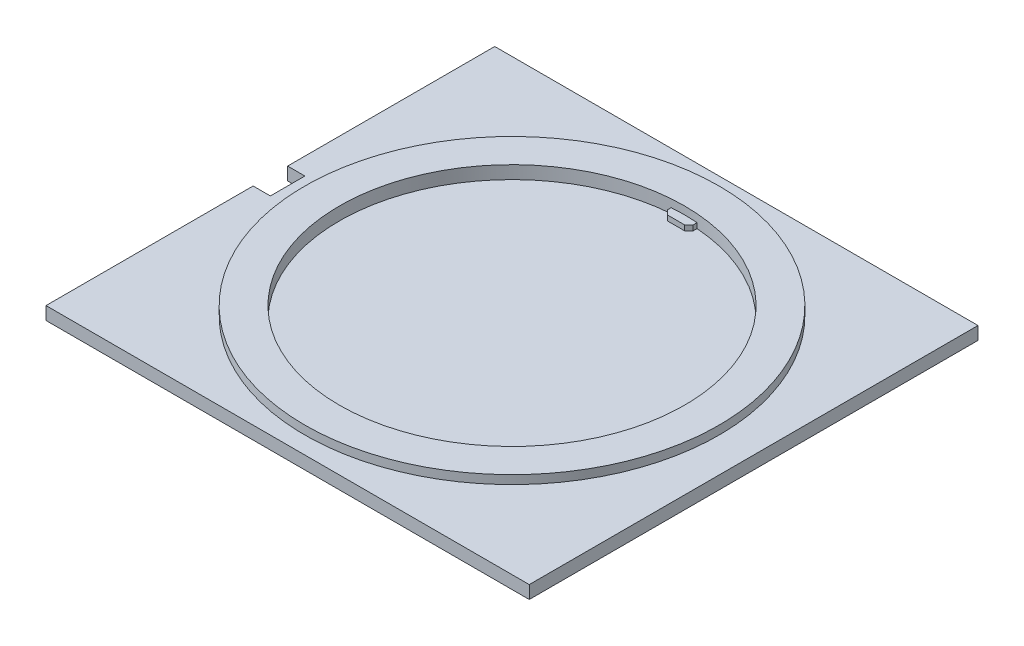
ISO-10303-21;
HEADER;
FILE_DESCRIPTION(('STEP AP214'),'2;1');
FILE_NAME('part.step','',(''),(''),'','','');
FILE_SCHEMA(('AUTOMOTIVE_DESIGN { 1 0 10303 214 1 1 1 1 }'));
ENDSEC;
DATA;
#1=APPLICATION_CONTEXT('core data for automotive mechanical design processes');
#2=APPLICATION_PROTOCOL_DEFINITION('international standard','automotive_design',2000,#1);
#3=PRODUCT_CONTEXT('',#1,'mechanical');
#4=PRODUCT('Part','Part','',(#3));
#5=PRODUCT_RELATED_PRODUCT_CATEGORY('part','',(#4));
#6=PRODUCT_DEFINITION_FORMATION('','',#4);
#7=PRODUCT_DEFINITION_CONTEXT('part definition',#1,'design');
#8=PRODUCT_DEFINITION('design','',#6,#7);
#9=PRODUCT_DEFINITION_SHAPE('','',#8);
#10=(LENGTH_UNIT() NAMED_UNIT(*) SI_UNIT(.MILLI.,.METRE.));
#11=(NAMED_UNIT(*) PLANE_ANGLE_UNIT() SI_UNIT($,.RADIAN.));
#12=(NAMED_UNIT(*) SI_UNIT($,.STERADIAN.) SOLID_ANGLE_UNIT());
#13=UNCERTAINTY_MEASURE_WITH_UNIT(LENGTH_MEASURE(1.E-05),#10,'distance_accuracy_value','');
#14=(GEOMETRIC_REPRESENTATION_CONTEXT(3) GLOBAL_UNCERTAINTY_ASSIGNED_CONTEXT((#13)) GLOBAL_UNIT_ASSIGNED_CONTEXT((#10,
#11,#12)) REPRESENTATION_CONTEXT('',''));
#15=CARTESIAN_POINT('',(0.,0.,0.));
#16=DIRECTION('',(0.,0.,1.));
#17=DIRECTION('',(1.,0.,0.));
#18=AXIS2_PLACEMENT_3D('',#15,#16,#17);
#19=CARTESIAN_POINT('',(-28.,77.9198926981712,-26.));
#20=DIRECTION('',(-1.,0.,0.));
#21=DIRECTION('',(0.,0.,1.));
#22=AXIS2_PLACEMENT_3D('',#19,#20,#21);
#23=PLANE('',#22);
#24=DIRECTION('',(0.,-1.,0.));
#25=VECTOR('',#24,1.);
#26=CARTESIAN_POINT('',(-28.,77.9198926981712,-2.00000000000001));
#27=LINE('',#26,#25);
#28=CARTESIAN_POINT('',(-28.,1.5,-2.00000000000001));
#29=VERTEX_POINT('',#28);
#30=CARTESIAN_POINT('',(-28.,0.,-2.00000000000001));
#31=VERTEX_POINT('',#30);
#32=EDGE_CURVE('E147',#29,#31,#27,.T.);
#33=ORIENTED_EDGE('',*,*,#32,.F.);
#34=DIRECTION('',(0.,0.,1.));
#35=VECTOR('',#34,1.);
#36=CARTESIAN_POINT('',(-28.,1.5,-26.));
#37=LINE('',#36,#35);
#38=CARTESIAN_POINT('',(-28.,1.5,-26.));
#39=VERTEX_POINT('',#38);
#40=EDGE_CURVE('E195',#39,#29,#37,.T.);
#41=ORIENTED_EDGE('',*,*,#40,.F.);
#42=DIRECTION('',(0.,-1.,0.));
#43=VECTOR('',#42,1.);
#44=CARTESIAN_POINT('',(-28.,77.9198926981712,-26.));
#45=LINE('',#44,#43);
#46=CARTESIAN_POINT('',(-28.,0.,-26.));
#47=VERTEX_POINT('',#46);
#48=EDGE_CURVE('E216',#39,#47,#45,.T.);
#49=ORIENTED_EDGE('',*,*,#48,.T.);
#50=DIRECTION('',(0.,0.,-1.));
#51=VECTOR('',#50,1.);
#52=CARTESIAN_POINT('',(-28.,0.,-26.));
#53=LINE('',#52,#51);
#54=EDGE_CURVE('E207',#31,#47,#53,.T.);
#55=ORIENTED_EDGE('',*,*,#54,.F.);
#56=EDGE_LOOP('',(#33,#41,#49,#55));
#57=FACE_BOUND('',#56,.T.);
#58=ADVANCED_FACE('F35',(#57),#23,.T.);
#59=CARTESIAN_POINT('',(0.,2.5,0.));
#60=DIRECTION('',(0.,-1.,0.));
#61=DIRECTION('',(0.,0.,-1.));
#62=AXIS2_PLACEMENT_3D('',#59,#60,#61);
#63=CYLINDRICAL_SURFACE('',#62,20.);
#64=CARTESIAN_POINT('',(0.,2.5,0.));
#65=DIRECTION('',(0.,1.,0.));
#66=DIRECTION('',(0.,0.,1.));
#67=AXIS2_PLACEMENT_3D('',#64,#65,#66);
#68=CIRCLE('',#67,20.);
#69=CARTESIAN_POINT('',(0.,2.5,20.));
#70=VERTEX_POINT('',#69);
#71=EDGE_CURVE('E222',#70,#70,#68,.T.);
#72=ORIENTED_EDGE('',*,*,#71,.T.);
#73=EDGE_LOOP('',(#72));
#74=FACE_BOUND('',#73,.T.);
#75=CARTESIAN_POINT('',(0.,1.,0.));
#76=DIRECTION('',(0.,-1.,0.));
#77=DIRECTION('',(0.,0.,-1.));
#78=AXIS2_PLACEMENT_3D('',#75,#76,#77);
#79=CIRCLE('',#78,20.);
#80=CARTESIAN_POINT('',(1.49999999999997,1.,-19.9436706751791));
#81=VERTEX_POINT('',#80);
#82=CARTESIAN_POINT('',(-1.50000000000003,1.,-19.9436706751791));
#83=VERTEX_POINT('',#82);
#84=EDGE_CURVE('E193',#81,#83,#79,.T.);
#85=ORIENTED_EDGE('',*,*,#84,.T.);
#86=DIRECTION('',(0.,-1.,0.));
#87=VECTOR('',#86,1.);
#88=CARTESIAN_POINT('',(-1.50000000000003,1.6,-19.9436706751791));
#89=LINE('',#88,#87);
#90=CARTESIAN_POINT('',(-1.50000000000003,1.6,-19.9436706751791));
#91=VERTEX_POINT('',#90);
#92=EDGE_CURVE('E188',#91,#83,#89,.T.);
#93=ORIENTED_EDGE('',*,*,#92,.F.);
#94=CARTESIAN_POINT('',(0.,1.6,0.));
#95=DIRECTION('',(0.,1.,0.));
#96=DIRECTION('',(0.,0.,1.));
#97=AXIS2_PLACEMENT_3D('',#94,#95,#96);
#98=CIRCLE('',#97,20.);
#99=CARTESIAN_POINT('',(1.49999999999997,1.6,-19.9436706751791));
#100=VERTEX_POINT('',#99);
#101=EDGE_CURVE('E167',#100,#91,#98,.T.);
#102=ORIENTED_EDGE('',*,*,#101,.F.);
#103=DIRECTION('',(0.,-1.,0.));
#104=VECTOR('',#103,1.);
#105=CARTESIAN_POINT('',(1.49999999999997,1.6,-19.9436706751791));
#106=LINE('',#105,#104);
#107=EDGE_CURVE('E180',#100,#81,#106,.T.);
#108=ORIENTED_EDGE('',*,*,#107,.T.);
#109=EDGE_LOOP('',(#85,#93,#102,#108));
#110=FACE_BOUND('',#109,.T.);
#111=ADVANCED_FACE('F267',(#74,#110),#63,.F.);
#112=CARTESIAN_POINT('',(0.,1.,0.));
#113=DIRECTION('',(0.,-1.,0.));
#114=DIRECTION('',(0.,0.,-1.));
#115=AXIS2_PLACEMENT_3D('',#112,#113,#114);
#116=PLANE('',#115);
#117=DIRECTION('',(0.,0.,1.));
#118=VECTOR('',#117,1.);
#119=CARTESIAN_POINT('',(-1.50000000000003,1.,0.));
#120=LINE('',#119,#118);
#121=CARTESIAN_POINT('',(-1.50000000000003,1.,-19.5));
#122=VERTEX_POINT('',#121);
#123=EDGE_CURVE('E166',#83,#122,#120,.T.);
#124=ORIENTED_EDGE('',*,*,#123,.F.);
#125=ORIENTED_EDGE('',*,*,#84,.F.);
#126=DIRECTION('',(0.,0.,1.));
#127=VECTOR('',#126,1.);
#128=CARTESIAN_POINT('',(1.49999999999997,1.,0.));
#129=LINE('',#128,#127);
#130=CARTESIAN_POINT('',(1.49999999999997,1.,-19.5));
#131=VERTEX_POINT('',#130);
#132=EDGE_CURVE('E171',#81,#131,#129,.T.);
#133=ORIENTED_EDGE('',*,*,#132,.T.);
#134=DIRECTION('',(0.70710678118655,0.,-0.707106781186545));
#135=VECTOR('',#134,1.);
#136=CARTESIAN_POINT('',(-9.00000000000002,1.,-9.00000000000008));
#137=LINE('',#136,#135);
#138=CARTESIAN_POINT('',(0.999999999999972,1.,-19.));
#139=VERTEX_POINT('',#138);
#140=EDGE_CURVE('E247',#131,#139,#137,.F.);
#141=ORIENTED_EDGE('',*,*,#140,.T.);
#142=DIRECTION('',(-1.,0.,0.));
#143=VECTOR('',#142,1.);
#144=CARTESIAN_POINT('',(0.,1.,-19.));
#145=LINE('',#144,#143);
#146=CARTESIAN_POINT('',(-1.00000000000003,1.,-19.));
#147=VERTEX_POINT('',#146);
#148=EDGE_CURVE('E182',#139,#147,#145,.T.);
#149=ORIENTED_EDGE('',*,*,#148,.T.);
#150=DIRECTION('',(-0.707106781186548,0.,-0.707106781186547));
#151=VECTOR('',#150,1.);
#152=CARTESIAN_POINT('',(8.99999999999999,1.,-8.99999999999999));
#153=LINE('',#152,#151);
#154=EDGE_CURVE('E43',#147,#122,#153,.T.);
#155=ORIENTED_EDGE('',*,*,#154,.T.);
#156=EDGE_LOOP('',(#124,#125,#133,#141,#149,#155));
#157=FACE_BOUND('',#156,.T.);
#158=ADVANCED_FACE('F249',(#157),#116,.F.);
#159=CARTESIAN_POINT('',(0.,2.5,0.));
#160=DIRECTION('',(0.,-1.,0.));
#161=DIRECTION('',(0.,0.,-1.));
#162=AXIS2_PLACEMENT_3D('',#159,#160,#161);
#163=CYLINDRICAL_SURFACE('',#162,24.);
#164=CARTESIAN_POINT('',(0.,2.5,0.));
#165=DIRECTION('',(0.,1.,0.));
#166=DIRECTION('',(0.,0.,1.));
#167=AXIS2_PLACEMENT_3D('',#164,#165,#166);
#168=CIRCLE('',#167,24.);
#169=CARTESIAN_POINT('',(0.,2.5,24.));
#170=VERTEX_POINT('',#169);
#171=EDGE_CURVE('E225',#170,#170,#168,.T.);
#172=ORIENTED_EDGE('',*,*,#171,.F.);
#173=EDGE_LOOP('',(#172));
#174=FACE_BOUND('',#173,.T.);
#175=CARTESIAN_POINT('',(0.,1.5,0.));
#176=DIRECTION('',(0.,-1.,0.));
#177=DIRECTION('',(0.,0.,-1.));
#178=AXIS2_PLACEMENT_3D('',#175,#176,#177);
#179=CIRCLE('',#178,24.);
#180=CARTESIAN_POINT('',(0.,1.5,-24.));
#181=VERTEX_POINT('',#180);
#182=EDGE_CURVE('E228',#181,#181,#179,.T.);
#183=ORIENTED_EDGE('',*,*,#182,.F.);
#184=EDGE_LOOP('',(#183));
#185=FACE_BOUND('',#184,.T.);
#186=ADVANCED_FACE('F350',(#174,#185),#163,.T.);
#187=CARTESIAN_POINT('',(0.,2.5,0.));
#188=DIRECTION('',(0.,1.,0.));
#189=DIRECTION('',(0.,0.,1.));
#190=AXIS2_PLACEMENT_3D('',#187,#188,#189);
#191=PLANE('',#190);
#192=ORIENTED_EDGE('',*,*,#171,.T.);
#193=EDGE_LOOP('',(#192));
#194=FACE_BOUND('',#193,.T.);
#195=ORIENTED_EDGE('',*,*,#71,.F.);
#196=EDGE_LOOP('',(#195));
#197=FACE_BOUND('',#196,.T.);
#198=ADVANCED_FACE('F303',(#194,#197),#191,.T.);
#199=CARTESIAN_POINT('',(-28.,77.9198926981712,26.));
#200=DIRECTION('',(0.,0.,1.));
#201=DIRECTION('',(1.,0.,0.));
#202=AXIS2_PLACEMENT_3D('',#199,#200,#201);
#203=PLANE('',#202);
#204=DIRECTION('',(1.,0.,0.));
#205=VECTOR('',#204,1.);
#206=CARTESIAN_POINT('',(-28.,1.5,26.));
#207=LINE('',#206,#205);
#208=CARTESIAN_POINT('',(-28.,1.5,26.));
#209=VERTEX_POINT('',#208);
#210=CARTESIAN_POINT('',(28.,1.5,26.));
#211=VERTEX_POINT('',#210);
#212=EDGE_CURVE('E191',#209,#211,#207,.T.);
#213=ORIENTED_EDGE('',*,*,#212,.F.);
#214=DIRECTION('',(0.,-1.,0.));
#215=VECTOR('',#214,1.);
#216=CARTESIAN_POINT('',(-28.,77.9198926981712,26.));
#217=LINE('',#216,#215);
#218=CARTESIAN_POINT('',(-28.,0.,26.));
#219=VERTEX_POINT('',#218);
#220=EDGE_CURVE('E219',#209,#219,#217,.T.);
#221=ORIENTED_EDGE('',*,*,#220,.T.);
#222=DIRECTION('',(-1.,0.,0.));
#223=VECTOR('',#222,1.);
#224=CARTESIAN_POINT('',(-28.,0.,26.));
#225=LINE('',#224,#223);
#226=CARTESIAN_POINT('',(28.,0.,26.));
#227=VERTEX_POINT('',#226);
#228=EDGE_CURVE('E204',#227,#219,#225,.T.);
#229=ORIENTED_EDGE('',*,*,#228,.F.);
#230=DIRECTION('',(0.,-1.,0.));
#231=VECTOR('',#230,1.);
#232=CARTESIAN_POINT('',(28.,77.9198926981712,26.));
#233=LINE('',#232,#231);
#234=EDGE_CURVE('E213',#211,#227,#233,.T.);
#235=ORIENTED_EDGE('',*,*,#234,.F.);
#236=EDGE_LOOP('',(#213,#221,#229,#235));
#237=FACE_BOUND('',#236,.T.);
#238=ADVANCED_FACE('F295',(#237),#203,.T.);
#239=DIRECTION('',(0.,1.,0.));
#240=VECTOR('',#239,1.);
#241=CARTESIAN_POINT('',(-28.,77.9198926981712,1.99999999999999));
#242=LINE('',#241,#240);
#243=CARTESIAN_POINT('',(-28.,0.,1.99999999999999));
#244=VERTEX_POINT('',#243);
#245=CARTESIAN_POINT('',(-28.,1.5,1.99999999999999));
#246=VERTEX_POINT('',#245);
#247=EDGE_CURVE('E160',#244,#246,#242,.T.);
#248=ORIENTED_EDGE('',*,*,#247,.F.);
#249=EDGE_CURVE('E208',#219,#244,#53,.T.);
#250=ORIENTED_EDGE('',*,*,#249,.F.);
#251=ORIENTED_EDGE('',*,*,#220,.F.);
#252=EDGE_CURVE('E199',#246,#209,#37,.T.);
#253=ORIENTED_EDGE('',*,*,#252,.F.);
#254=EDGE_LOOP('',(#248,#250,#251,#253));
#255=FACE_BOUND('',#254,.T.);
#256=ADVANCED_FACE('F283',(#255),#23,.T.);
#257=CARTESIAN_POINT('',(-28.,77.9198926981712,-26.));
#258=DIRECTION('',(0.,0.,-1.));
#259=DIRECTION('',(-1.,0.,0.));
#260=AXIS2_PLACEMENT_3D('',#257,#258,#259);
#261=PLANE('',#260);
#262=DIRECTION('',(-1.,0.,0.));
#263=VECTOR('',#262,1.);
#264=CARTESIAN_POINT('',(-28.,1.5,-26.));
#265=LINE('',#264,#263);
#266=CARTESIAN_POINT('',(28.,1.5,-26.));
#267=VERTEX_POINT('',#266);
#268=EDGE_CURVE('E198',#267,#39,#265,.T.);
#269=ORIENTED_EDGE('',*,*,#268,.F.);
#270=DIRECTION('',(0.,-1.,0.));
#271=VECTOR('',#270,1.);
#272=CARTESIAN_POINT('',(28.,77.9198926981712,-26.));
#273=LINE('',#272,#271);
#274=CARTESIAN_POINT('',(28.,0.,-26.));
#275=VERTEX_POINT('',#274);
#276=EDGE_CURVE('E214',#267,#275,#273,.T.);
#277=ORIENTED_EDGE('',*,*,#276,.T.);
#278=DIRECTION('',(1.,0.,0.));
#279=VECTOR('',#278,1.);
#280=CARTESIAN_POINT('',(-28.,0.,-26.));
#281=LINE('',#280,#279);
#282=EDGE_CURVE('E210',#47,#275,#281,.T.);
#283=ORIENTED_EDGE('',*,*,#282,.F.);
#284=ORIENTED_EDGE('',*,*,#48,.F.);
#285=EDGE_LOOP('',(#269,#277,#283,#284));
#286=FACE_BOUND('',#285,.T.);
#287=ADVANCED_FACE('F294',(#286),#261,.T.);
#288=CARTESIAN_POINT('',(28.,77.9198926981712,-26.));
#289=DIRECTION('',(1.,0.,0.));
#290=DIRECTION('',(0.,0.,-1.));
#291=AXIS2_PLACEMENT_3D('',#288,#289,#290);
#292=PLANE('',#291);
#293=DIRECTION('',(0.,0.,-1.));
#294=VECTOR('',#293,1.);
#295=CARTESIAN_POINT('',(28.,1.5,-26.));
#296=LINE('',#295,#294);
#297=EDGE_CURVE('E194',#211,#267,#296,.T.);
#298=ORIENTED_EDGE('',*,*,#297,.F.);
#299=ORIENTED_EDGE('',*,*,#234,.T.);
#300=DIRECTION('',(0.,0.,1.));
#301=VECTOR('',#300,1.);
#302=CARTESIAN_POINT('',(28.,0.,-26.));
#303=LINE('',#302,#301);
#304=EDGE_CURVE('E190',#275,#227,#303,.T.);
#305=ORIENTED_EDGE('',*,*,#304,.F.);
#306=ORIENTED_EDGE('',*,*,#276,.F.);
#307=EDGE_LOOP('',(#298,#299,#305,#306));
#308=FACE_BOUND('',#307,.T.);
#309=ADVANCED_FACE('F301',(#308),#292,.T.);
#310=CARTESIAN_POINT('',(-3.,1.5,0.));
#311=DIRECTION('',(0.,-1.,0.));
#312=DIRECTION('',(0.,0.,-1.));
#313=AXIS2_PLACEMENT_3D('',#310,#311,#312);
#314=PLANE('',#313);
#315=ORIENTED_EDGE('',*,*,#40,.T.);
#316=DIRECTION('',(1.,0.,0.));
#317=VECTOR('',#316,1.);
#318=CARTESIAN_POINT('',(-3.,1.5,-2.00000000000001));
#319=LINE('',#318,#317);
#320=CARTESIAN_POINT('',(-26.,1.5,-2.00000000000001));
#321=VERTEX_POINT('',#320);
#322=EDGE_CURVE('E162',#29,#321,#319,.T.);
#323=ORIENTED_EDGE('',*,*,#322,.T.);
#324=DIRECTION('',(0.,0.,1.));
#325=VECTOR('',#324,1.);
#326=CARTESIAN_POINT('',(-26.,1.5,0.));
#327=LINE('',#326,#325);
#328=CARTESIAN_POINT('',(-26.,1.5,1.99999999999999));
#329=VERTEX_POINT('',#328);
#330=EDGE_CURVE('E139',#321,#329,#327,.T.);
#331=ORIENTED_EDGE('',*,*,#330,.T.);
#332=DIRECTION('',(-1.,0.,0.));
#333=VECTOR('',#332,1.);
#334=CARTESIAN_POINT('',(-3.,1.5,1.99999999999999));
#335=LINE('',#334,#333);
#336=EDGE_CURVE('E142',#329,#246,#335,.T.);
#337=ORIENTED_EDGE('',*,*,#336,.T.);
#338=ORIENTED_EDGE('',*,*,#252,.T.);
#339=ORIENTED_EDGE('',*,*,#212,.T.);
#340=ORIENTED_EDGE('',*,*,#297,.T.);
#341=ORIENTED_EDGE('',*,*,#268,.T.);
#342=EDGE_LOOP('',(#315,#323,#331,#337,#338,#339,#340,#341));
#343=FACE_BOUND('',#342,.T.);
#344=ORIENTED_EDGE('',*,*,#182,.T.);
#345=EDGE_LOOP('',(#344));
#346=FACE_BOUND('',#345,.T.);
#347=ADVANCED_FACE('F316',(#343,#346),#314,.F.);
#348=CARTESIAN_POINT('',(0.,0.,0.));
#349=DIRECTION('',(0.,1.,0.));
#350=DIRECTION('',(0.,0.,1.));
#351=AXIS2_PLACEMENT_3D('',#348,#349,#350);
#352=PLANE('',#351);
#353=DIRECTION('',(0.,0.,1.));
#354=VECTOR('',#353,1.);
#355=CARTESIAN_POINT('',(-26.,0.,-2.00000000000001));
#356=LINE('',#355,#354);
#357=CARTESIAN_POINT('',(-26.,0.,-2.00000000000001));
#358=VERTEX_POINT('',#357);
#359=CARTESIAN_POINT('',(-26.,0.,1.99999999999999));
#360=VERTEX_POINT('',#359);
#361=EDGE_CURVE('E50',#358,#360,#356,.T.);
#362=ORIENTED_EDGE('',*,*,#361,.F.);
#363=DIRECTION('',(-1.,0.,0.));
#364=VECTOR('',#363,1.);
#365=CARTESIAN_POINT('',(0.,0.,-2.00000000000001));
#366=LINE('',#365,#364);
#367=EDGE_CURVE('E11',#358,#31,#366,.T.);
#368=ORIENTED_EDGE('',*,*,#367,.T.);
#369=ORIENTED_EDGE('',*,*,#54,.T.);
#370=ORIENTED_EDGE('',*,*,#282,.T.);
#371=ORIENTED_EDGE('',*,*,#304,.T.);
#372=ORIENTED_EDGE('',*,*,#228,.T.);
#373=ORIENTED_EDGE('',*,*,#249,.T.);
#374=DIRECTION('',(-1.,0.,0.));
#375=VECTOR('',#374,1.);
#376=CARTESIAN_POINT('',(-44.1882960905821,0.,1.99999999999999));
#377=LINE('',#376,#375);
#378=EDGE_CURVE('E153',#360,#244,#377,.T.);
#379=ORIENTED_EDGE('',*,*,#378,.F.);
#380=EDGE_LOOP('',(#362,#368,#369,#370,#371,#372,#373,#379));
#381=FACE_BOUND('',#380,.T.);
#382=ADVANCED_FACE('F151',(#381),#352,.F.);
#383=CARTESIAN_POINT('',(-1.50000000000003,1.6,0.));
#384=DIRECTION('',(1.,0.,0.));
#385=DIRECTION('',(0.,0.,-1.));
#386=AXIS2_PLACEMENT_3D('',#383,#384,#385);
#387=PLANE('',#386);
#388=ORIENTED_EDGE('',*,*,#123,.T.);
#389=DIRECTION('',(0.,1.,0.));
#390=VECTOR('',#389,1.);
#391=CARTESIAN_POINT('',(-1.50000000000003,1.6,-19.5));
#392=LINE('',#391,#390);
#393=CARTESIAN_POINT('',(-1.50000000000003,1.6,-19.5));
#394=VERTEX_POINT('',#393);
#395=EDGE_CURVE('E245',#122,#394,#392,.T.);
#396=ORIENTED_EDGE('',*,*,#395,.T.);
#397=DIRECTION('',(0.,0.,1.));
#398=VECTOR('',#397,1.);
#399=CARTESIAN_POINT('',(-1.50000000000003,1.6,0.));
#400=LINE('',#399,#398);
#401=EDGE_CURVE('E170',#91,#394,#400,.T.);
#402=ORIENTED_EDGE('',*,*,#401,.F.);
#403=ORIENTED_EDGE('',*,*,#92,.T.);
#404=EDGE_LOOP('',(#388,#396,#402,#403));
#405=FACE_BOUND('',#404,.T.);
#406=ADVANCED_FACE('F271',(#405),#387,.F.);
#407=CARTESIAN_POINT('',(0.,1.6,-19.));
#408=DIRECTION('',(0.,0.,1.));
#409=DIRECTION('',(1.,0.,0.));
#410=AXIS2_PLACEMENT_3D('',#407,#408,#409);
#411=PLANE('',#410);
#412=ORIENTED_EDGE('',*,*,#148,.F.);
#413=DIRECTION('',(0.,1.,0.));
#414=VECTOR('',#413,1.);
#415=CARTESIAN_POINT('',(0.999999999999972,1.6,-19.));
#416=LINE('',#415,#414);
#417=CARTESIAN_POINT('',(0.999999999999972,1.6,-19.));
#418=VERTEX_POINT('',#417);
#419=EDGE_CURVE('E239',#139,#418,#416,.T.);
#420=ORIENTED_EDGE('',*,*,#419,.T.);
#421=DIRECTION('',(-1.,0.,0.));
#422=VECTOR('',#421,1.);
#423=CARTESIAN_POINT('',(0.,1.6,-19.));
#424=LINE('',#423,#422);
#425=CARTESIAN_POINT('',(-1.00000000000003,1.6,-19.));
#426=VERTEX_POINT('',#425);
#427=EDGE_CURVE('E174',#418,#426,#424,.T.);
#428=ORIENTED_EDGE('',*,*,#427,.T.);
#429=DIRECTION('',(0.,-1.,0.));
#430=VECTOR('',#429,1.);
#431=CARTESIAN_POINT('',(-1.00000000000003,1.,-19.));
#432=LINE('',#431,#430);
#433=EDGE_CURVE('E236',#426,#147,#432,.T.);
#434=ORIENTED_EDGE('',*,*,#433,.T.);
#435=EDGE_LOOP('',(#412,#420,#428,#434));
#436=FACE_BOUND('',#435,.T.);
#437=ADVANCED_FACE('F255',(#436),#411,.T.);
#438=CARTESIAN_POINT('',(1.49999999999997,1.6,0.));
#439=DIRECTION('',(1.,0.,0.));
#440=DIRECTION('',(0.,0.,-1.));
#441=AXIS2_PLACEMENT_3D('',#438,#439,#440);
#442=PLANE('',#441);
#443=DIRECTION('',(0.,0.,1.));
#444=VECTOR('',#443,1.);
#445=CARTESIAN_POINT('',(1.49999999999997,1.6,0.));
#446=LINE('',#445,#444);
#447=CARTESIAN_POINT('',(1.49999999999997,1.6,-19.5));
#448=VERTEX_POINT('',#447);
#449=EDGE_CURVE('E177',#100,#448,#446,.T.);
#450=ORIENTED_EDGE('',*,*,#449,.T.);
#451=DIRECTION('',(0.,-1.,0.));
#452=VECTOR('',#451,1.);
#453=CARTESIAN_POINT('',(1.49999999999997,1.6,-19.5));
#454=LINE('',#453,#452);
#455=EDGE_CURVE('E233',#448,#131,#454,.T.);
#456=ORIENTED_EDGE('',*,*,#455,.T.);
#457=ORIENTED_EDGE('',*,*,#132,.F.);
#458=ORIENTED_EDGE('',*,*,#107,.F.);
#459=EDGE_LOOP('',(#450,#456,#457,#458));
#460=FACE_BOUND('',#459,.T.);
#461=ADVANCED_FACE('F265',(#460),#442,.T.);
#462=CARTESIAN_POINT('',(0.,1.6,0.));
#463=DIRECTION('',(0.,1.,0.));
#464=DIRECTION('',(0.,0.,1.));
#465=AXIS2_PLACEMENT_3D('',#462,#463,#464);
#466=PLANE('',#465);
#467=ORIENTED_EDGE('',*,*,#427,.F.);
#468=DIRECTION('',(-0.70710678118655,0.,0.707106781186545));
#469=VECTOR('',#468,1.);
#470=CARTESIAN_POINT('',(-9.00000000000002,1.6,-9.00000000000008));
#471=LINE('',#470,#469);
#472=EDGE_CURVE('E243',#418,#448,#471,.F.);
#473=ORIENTED_EDGE('',*,*,#472,.T.);
#474=ORIENTED_EDGE('',*,*,#449,.F.);
#475=ORIENTED_EDGE('',*,*,#101,.T.);
#476=ORIENTED_EDGE('',*,*,#401,.T.);
#477=DIRECTION('',(0.707106781186548,0.,0.707106781186547));
#478=VECTOR('',#477,1.);
#479=CARTESIAN_POINT('',(8.99999999999999,1.6,-8.99999999999999));
#480=LINE('',#479,#478);
#481=EDGE_CURVE('E241',#394,#426,#480,.T.);
#482=ORIENTED_EDGE('',*,*,#481,.T.);
#483=EDGE_LOOP('',(#467,#473,#474,#475,#476,#482));
#484=FACE_BOUND('',#483,.T.);
#485=ADVANCED_FACE('F262',(#484),#466,.T.);
#486=CARTESIAN_POINT('',(1.49999999999997,1.6,-19.5));
#487=DIRECTION('',(-0.707106781186545,0.,-0.70710678118655));
#488=DIRECTION('',(0.,-1.,0.));
#489=AXIS2_PLACEMENT_3D('',#486,#487,#488);
#490=PLANE('',#489);
#491=ORIENTED_EDGE('',*,*,#472,.F.);
#492=ORIENTED_EDGE('',*,*,#419,.F.);
#493=ORIENTED_EDGE('',*,*,#140,.F.);
#494=ORIENTED_EDGE('',*,*,#455,.F.);
#495=EDGE_LOOP('',(#491,#492,#493,#494));
#496=FACE_BOUND('',#495,.T.);
#497=ADVANCED_FACE('F259',(#496),#490,.F.);
#498=CARTESIAN_POINT('',(-1.00000000000003,1.6,-19.));
#499=DIRECTION('',(-0.707106781186547,0.,0.707106781186548));
#500=DIRECTION('',(0.,1.,0.));
#501=AXIS2_PLACEMENT_3D('',#498,#499,#500);
#502=PLANE('',#501);
#503=ORIENTED_EDGE('',*,*,#481,.F.);
#504=ORIENTED_EDGE('',*,*,#395,.F.);
#505=ORIENTED_EDGE('',*,*,#154,.F.);
#506=ORIENTED_EDGE('',*,*,#433,.F.);
#507=EDGE_LOOP('',(#503,#504,#505,#506));
#508=FACE_BOUND('',#507,.T.);
#509=ADVANCED_FACE('F37',(#508),#502,.T.);
#510=CARTESIAN_POINT('',(-26.,2.5,-2.00000000000001));
#511=DIRECTION('',(1.,0.,0.));
#512=DIRECTION('',(0.,0.,-1.));
#513=AXIS2_PLACEMENT_3D('',#510,#511,#512);
#514=PLANE('',#513);
#515=DIRECTION('',(0.,-1.,0.));
#516=VECTOR('',#515,1.);
#517=CARTESIAN_POINT('',(-26.,2.5,-2.00000000000001));
#518=LINE('',#517,#516);
#519=EDGE_CURVE('E135',#321,#358,#518,.T.);
#520=ORIENTED_EDGE('',*,*,#519,.T.);
#521=ORIENTED_EDGE('',*,*,#361,.T.);
#522=DIRECTION('',(0.,-1.,0.));
#523=VECTOR('',#522,1.);
#524=CARTESIAN_POINT('',(-26.,2.5,1.99999999999999));
#525=LINE('',#524,#523);
#526=EDGE_CURVE('E143',#329,#360,#525,.T.);
#527=ORIENTED_EDGE('',*,*,#526,.F.);
#528=ORIENTED_EDGE('',*,*,#330,.F.);
#529=EDGE_LOOP('',(#520,#521,#527,#528));
#530=FACE_BOUND('',#529,.T.);
#531=ADVANCED_FACE('F137',(#530),#514,.F.);
#532=CARTESIAN_POINT('',(-44.1882960905821,2.5,-2.00000000000001));
#533=DIRECTION('',(0.,0.,-1.));
#534=DIRECTION('',(-1.,0.,0.));
#535=AXIS2_PLACEMENT_3D('',#532,#533,#534);
#536=PLANE('',#535);
#537=ORIENTED_EDGE('',*,*,#32,.T.);
#538=ORIENTED_EDGE('',*,*,#367,.F.);
#539=ORIENTED_EDGE('',*,*,#519,.F.);
#540=ORIENTED_EDGE('',*,*,#322,.F.);
#541=EDGE_LOOP('',(#537,#538,#539,#540));
#542=FACE_BOUND('',#541,.T.);
#543=ADVANCED_FACE('F145',(#542),#536,.F.);
#544=CARTESIAN_POINT('',(-44.1882960905821,2.5,1.99999999999999));
#545=DIRECTION('',(0.,0.,1.));
#546=DIRECTION('',(1.,0.,0.));
#547=AXIS2_PLACEMENT_3D('',#544,#545,#546);
#548=PLANE('',#547);
#549=ORIENTED_EDGE('',*,*,#247,.T.);
#550=ORIENTED_EDGE('',*,*,#336,.F.);
#551=ORIENTED_EDGE('',*,*,#526,.T.);
#552=ORIENTED_EDGE('',*,*,#378,.T.);
#553=EDGE_LOOP('',(#549,#550,#551,#552));
#554=FACE_BOUND('',#553,.T.);
#555=ADVANCED_FACE('F324',(#554),#548,.F.);
#556=CLOSED_SHELL('',(#58,#111,#158,#186,#198,#238,#256,#287,#309,#347,#382,#406,#437,#461,#485,
#497,#509,#531,#543,#555));
#557=MANIFOLD_SOLID_BREP('B2',#556);
#558=ADVANCED_BREP_SHAPE_REPRESENTATION('',(#18,#557),#14);
#559=SHAPE_DEFINITION_REPRESENTATION(#9,#558);
ENDSEC;
END-ISO-10303-21;
